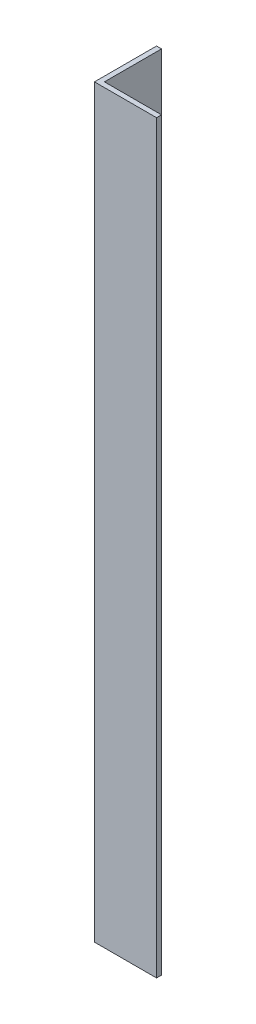
ISO-10303-21;
HEADER;
FILE_DESCRIPTION(('STEP AP214'),'2;1');
FILE_NAME('part.step','',(''),(''),'','','');
FILE_SCHEMA(('AUTOMOTIVE_DESIGN { 1 0 10303 214 1 1 1 1 }'));
ENDSEC;
DATA;
#1=APPLICATION_CONTEXT('core data for automotive mechanical design processes');
#2=APPLICATION_PROTOCOL_DEFINITION('international standard','automotive_design',2000,#1);
#3=PRODUCT_CONTEXT('',#1,'mechanical');
#4=PRODUCT('Part','Part','',(#3));
#5=PRODUCT_RELATED_PRODUCT_CATEGORY('part','',(#4));
#6=PRODUCT_DEFINITION_FORMATION('','',#4);
#7=PRODUCT_DEFINITION_CONTEXT('part definition',#1,'design');
#8=PRODUCT_DEFINITION('design','',#6,#7);
#9=PRODUCT_DEFINITION_SHAPE('','',#8);
#10=(LENGTH_UNIT() NAMED_UNIT(*) SI_UNIT(.MILLI.,.METRE.));
#11=(NAMED_UNIT(*) PLANE_ANGLE_UNIT() SI_UNIT($,.RADIAN.));
#12=(NAMED_UNIT(*) SI_UNIT($,.STERADIAN.) SOLID_ANGLE_UNIT());
#13=UNCERTAINTY_MEASURE_WITH_UNIT(LENGTH_MEASURE(1.E-05),#10,'distance_accuracy_value','');
#14=(GEOMETRIC_REPRESENTATION_CONTEXT(3) GLOBAL_UNCERTAINTY_ASSIGNED_CONTEXT((#13)) GLOBAL_UNIT_ASSIGNED_CONTEXT((#10,
#11,#12)) REPRESENTATION_CONTEXT('',''));
#15=CARTESIAN_POINT('',(0.,0.,0.));
#16=DIRECTION('',(0.,0.,1.));
#17=DIRECTION('',(1.,0.,0.));
#18=AXIS2_PLACEMENT_3D('',#15,#16,#17);
#19=CARTESIAN_POINT('',(-4.,600.,-46.));
#20=DIRECTION('',(0.,0.,1.));
#21=DIRECTION('',(1.,0.,0.));
#22=AXIS2_PLACEMENT_3D('',#19,#20,#21);
#23=PLANE('',#22);
#24=DIRECTION('',(-1.,0.,0.));
#25=VECTOR('',#24,1.);
#26=CARTESIAN_POINT('',(-4.,0.,-46.));
#27=LINE('',#26,#25);
#28=CARTESIAN_POINT('',(0.,0.,-46.));
#29=VERTEX_POINT('',#28);
#30=CARTESIAN_POINT('',(-4.,0.,-46.));
#31=VERTEX_POINT('',#30);
#32=EDGE_CURVE('E117',#29,#31,#27,.T.);
#33=ORIENTED_EDGE('',*,*,#32,.T.);
#34=DIRECTION('',(0.,-1.,0.));
#35=VECTOR('',#34,1.);
#36=CARTESIAN_POINT('',(-4.,600.,-46.));
#37=LINE('',#36,#35);
#38=CARTESIAN_POINT('',(-4.,600.,-46.));
#39=VERTEX_POINT('',#38);
#40=EDGE_CURVE('E11',#39,#31,#37,.T.);
#41=ORIENTED_EDGE('',*,*,#40,.F.);
#42=DIRECTION('',(-1.,0.,0.));
#43=VECTOR('',#42,1.);
#44=CARTESIAN_POINT('',(-4.,600.,-46.));
#45=LINE('',#44,#43);
#46=CARTESIAN_POINT('',(0.,600.,-46.));
#47=VERTEX_POINT('',#46);
#48=EDGE_CURVE('E127',#47,#39,#45,.T.);
#49=ORIENTED_EDGE('',*,*,#48,.F.);
#50=DIRECTION('',(0.,-1.,0.));
#51=VECTOR('',#50,1.);
#52=CARTESIAN_POINT('',(0.,600.,-46.));
#53=LINE('',#52,#51);
#54=EDGE_CURVE('E113',#47,#29,#53,.T.);
#55=ORIENTED_EDGE('',*,*,#54,.T.);
#56=EDGE_LOOP('',(#33,#41,#49,#55));
#57=FACE_BOUND('',#56,.T.);
#58=ADVANCED_FACE('F33',(#57),#23,.F.);
#59=CARTESIAN_POINT('',(-4.,600.,-46.));
#60=DIRECTION('',(1.,0.,0.));
#61=DIRECTION('',(0.,0.,-1.));
#62=AXIS2_PLACEMENT_3D('',#59,#60,#61);
#63=PLANE('',#62);
#64=DIRECTION('',(0.,0.,1.));
#65=VECTOR('',#64,1.);
#66=CARTESIAN_POINT('',(-4.,0.,-46.));
#67=LINE('',#66,#65);
#68=CARTESIAN_POINT('',(-3.99999999999999,0.,4.));
#69=VERTEX_POINT('',#68);
#70=EDGE_CURVE('E120',#31,#69,#67,.T.);
#71=ORIENTED_EDGE('',*,*,#70,.T.);
#72=DIRECTION('',(0.,-1.,0.));
#73=VECTOR('',#72,1.);
#74=CARTESIAN_POINT('',(-3.99999999999999,600.,4.));
#75=LINE('',#74,#73);
#76=CARTESIAN_POINT('',(-3.99999999999999,600.,4.));
#77=VERTEX_POINT('',#76);
#78=EDGE_CURVE('E41',#77,#69,#75,.T.);
#79=ORIENTED_EDGE('',*,*,#78,.F.);
#80=DIRECTION('',(0.,0.,1.));
#81=VECTOR('',#80,1.);
#82=CARTESIAN_POINT('',(-4.,600.,-46.));
#83=LINE('',#82,#81);
#84=EDGE_CURVE('E86',#39,#77,#83,.T.);
#85=ORIENTED_EDGE('',*,*,#84,.F.);
#86=ORIENTED_EDGE('',*,*,#40,.T.);
#87=EDGE_LOOP('',(#71,#79,#85,#86));
#88=FACE_BOUND('',#87,.T.);
#89=ADVANCED_FACE('F151',(#88),#63,.F.);
#90=CARTESIAN_POINT('',(-3.99999999999999,600.,4.));
#91=DIRECTION('',(0.,0.,-1.));
#92=DIRECTION('',(-1.,0.,0.));
#93=AXIS2_PLACEMENT_3D('',#90,#91,#92);
#94=PLANE('',#93);
#95=DIRECTION('',(1.,0.,0.));
#96=VECTOR('',#95,1.);
#97=CARTESIAN_POINT('',(-3.99999999999999,0.,4.));
#98=LINE('',#97,#96);
#99=CARTESIAN_POINT('',(46.,0.,4.));
#100=VERTEX_POINT('',#99);
#101=EDGE_CURVE('E122',#69,#100,#98,.T.);
#102=ORIENTED_EDGE('',*,*,#101,.T.);
#103=DIRECTION('',(0.,-1.,0.));
#104=VECTOR('',#103,1.);
#105=CARTESIAN_POINT('',(46.,600.,4.));
#106=LINE('',#105,#104);
#107=CARTESIAN_POINT('',(46.,600.,4.));
#108=VERTEX_POINT('',#107);
#109=EDGE_CURVE('E108',#108,#100,#106,.T.);
#110=ORIENTED_EDGE('',*,*,#109,.F.);
#111=DIRECTION('',(1.,0.,0.));
#112=VECTOR('',#111,1.);
#113=CARTESIAN_POINT('',(-3.99999999999999,600.,4.));
#114=LINE('',#113,#112);
#115=EDGE_CURVE('E99',#77,#108,#114,.T.);
#116=ORIENTED_EDGE('',*,*,#115,.F.);
#117=ORIENTED_EDGE('',*,*,#78,.T.);
#118=EDGE_LOOP('',(#102,#110,#116,#117));
#119=FACE_BOUND('',#118,.T.);
#120=ADVANCED_FACE('F133',(#119),#94,.F.);
#121=CARTESIAN_POINT('',(46.,600.,0.));
#122=DIRECTION('',(-1.,0.,0.));
#123=DIRECTION('',(0.,0.,1.));
#124=AXIS2_PLACEMENT_3D('',#121,#122,#123);
#125=PLANE('',#124);
#126=DIRECTION('',(0.,0.,-1.));
#127=VECTOR('',#126,1.);
#128=CARTESIAN_POINT('',(46.,0.,0.));
#129=LINE('',#128,#127);
#130=CARTESIAN_POINT('',(46.,0.,0.));
#131=VERTEX_POINT('',#130);
#132=EDGE_CURVE('E107',#100,#131,#129,.T.);
#133=ORIENTED_EDGE('',*,*,#132,.T.);
#134=DIRECTION('',(0.,-1.,0.));
#135=VECTOR('',#134,1.);
#136=CARTESIAN_POINT('',(46.,600.,0.));
#137=LINE('',#136,#135);
#138=CARTESIAN_POINT('',(46.,600.,0.));
#139=VERTEX_POINT('',#138);
#140=EDGE_CURVE('E104',#139,#131,#137,.T.);
#141=ORIENTED_EDGE('',*,*,#140,.F.);
#142=DIRECTION('',(0.,0.,-1.));
#143=VECTOR('',#142,1.);
#144=CARTESIAN_POINT('',(46.,600.,0.));
#145=LINE('',#144,#143);
#146=EDGE_CURVE('E93',#108,#139,#145,.T.);
#147=ORIENTED_EDGE('',*,*,#146,.F.);
#148=ORIENTED_EDGE('',*,*,#109,.T.);
#149=EDGE_LOOP('',(#133,#141,#147,#148));
#150=FACE_BOUND('',#149,.T.);
#151=ADVANCED_FACE('F105',(#150),#125,.F.);
#152=CARTESIAN_POINT('',(0.,600.,0.));
#153=DIRECTION('',(0.,0.,1.));
#154=DIRECTION('',(1.,0.,0.));
#155=AXIS2_PLACEMENT_3D('',#152,#153,#154);
#156=PLANE('',#155);
#157=DIRECTION('',(-1.,0.,0.));
#158=VECTOR('',#157,1.);
#159=CARTESIAN_POINT('',(0.,0.,0.));
#160=LINE('',#159,#158);
#161=CARTESIAN_POINT('',(0.,0.,0.));
#162=VERTEX_POINT('',#161);
#163=EDGE_CURVE('E72',#131,#162,#160,.T.);
#164=ORIENTED_EDGE('',*,*,#163,.T.);
#165=DIRECTION('',(0.,-1.,0.));
#166=VECTOR('',#165,1.);
#167=CARTESIAN_POINT('',(0.,600.,0.));
#168=LINE('',#167,#166);
#169=CARTESIAN_POINT('',(0.,600.,0.));
#170=VERTEX_POINT('',#169);
#171=EDGE_CURVE('E109',#170,#162,#168,.T.);
#172=ORIENTED_EDGE('',*,*,#171,.F.);
#173=DIRECTION('',(-1.,0.,0.));
#174=VECTOR('',#173,1.);
#175=CARTESIAN_POINT('',(0.,600.,0.));
#176=LINE('',#175,#174);
#177=EDGE_CURVE('E97',#139,#170,#176,.T.);
#178=ORIENTED_EDGE('',*,*,#177,.F.);
#179=ORIENTED_EDGE('',*,*,#140,.T.);
#180=EDGE_LOOP('',(#164,#172,#178,#179));
#181=FACE_BOUND('',#180,.T.);
#182=ADVANCED_FACE('F111',(#181),#156,.F.);
#183=CARTESIAN_POINT('',(0.,600.,-46.));
#184=DIRECTION('',(-1.,0.,0.));
#185=DIRECTION('',(0.,0.,1.));
#186=AXIS2_PLACEMENT_3D('',#183,#184,#185);
#187=PLANE('',#186);
#188=DIRECTION('',(0.,0.,-1.));
#189=VECTOR('',#188,1.);
#190=CARTESIAN_POINT('',(0.,0.,-46.));
#191=LINE('',#190,#189);
#192=EDGE_CURVE('E78',#162,#29,#191,.T.);
#193=ORIENTED_EDGE('',*,*,#192,.T.);
#194=ORIENTED_EDGE('',*,*,#54,.F.);
#195=DIRECTION('',(0.,0.,-1.));
#196=VECTOR('',#195,1.);
#197=CARTESIAN_POINT('',(0.,600.,-46.));
#198=LINE('',#197,#196);
#199=EDGE_CURVE('E49',#170,#47,#198,.T.);
#200=ORIENTED_EDGE('',*,*,#199,.F.);
#201=ORIENTED_EDGE('',*,*,#171,.T.);
#202=EDGE_LOOP('',(#193,#194,#200,#201));
#203=FACE_BOUND('',#202,.T.);
#204=ADVANCED_FACE('F140',(#203),#187,.F.);
#205=CARTESIAN_POINT('',(0.,600.,0.));
#206=DIRECTION('',(0.,-1.,0.));
#207=DIRECTION('',(0.,0.,-1.));
#208=AXIS2_PLACEMENT_3D('',#205,#206,#207);
#209=PLANE('',#208);
#210=ORIENTED_EDGE('',*,*,#48,.T.);
#211=ORIENTED_EDGE('',*,*,#84,.T.);
#212=ORIENTED_EDGE('',*,*,#115,.T.);
#213=ORIENTED_EDGE('',*,*,#146,.T.);
#214=ORIENTED_EDGE('',*,*,#177,.T.);
#215=ORIENTED_EDGE('',*,*,#199,.T.);
#216=EDGE_LOOP('',(#210,#211,#212,#213,#214,#215));
#217=FACE_BOUND('',#216,.T.);
#218=ADVANCED_FACE('F95',(#217),#209,.F.);
#219=CARTESIAN_POINT('',(0.,0.,0.));
#220=DIRECTION('',(0.,-1.,0.));
#221=DIRECTION('',(0.,0.,-1.));
#222=AXIS2_PLACEMENT_3D('',#219,#220,#221);
#223=PLANE('',#222);
#224=ORIENTED_EDGE('',*,*,#32,.F.);
#225=ORIENTED_EDGE('',*,*,#192,.F.);
#226=ORIENTED_EDGE('',*,*,#163,.F.);
#227=ORIENTED_EDGE('',*,*,#132,.F.);
#228=ORIENTED_EDGE('',*,*,#101,.F.);
#229=ORIENTED_EDGE('',*,*,#70,.F.);
#230=EDGE_LOOP('',(#224,#225,#226,#227,#228,#229));
#231=FACE_BOUND('',#230,.T.);
#232=ADVANCED_FACE('F136',(#231),#223,.T.);
#233=CLOSED_SHELL('',(#58,#89,#120,#151,#182,#204,#218,#232));
#234=MANIFOLD_SOLID_BREP('B2',#233);
#235=ADVANCED_BREP_SHAPE_REPRESENTATION('',(#18,#234),#14);
#236=SHAPE_DEFINITION_REPRESENTATION(#9,#235);
ENDSEC;
END-ISO-10303-21;
